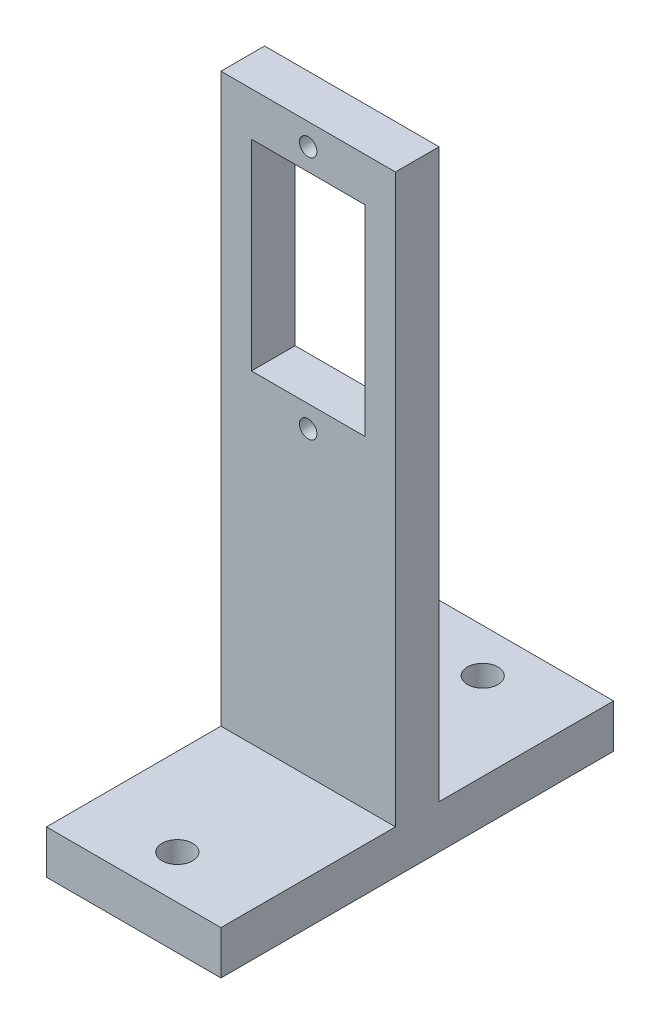
ISO-10303-21;
HEADER;
FILE_DESCRIPTION(('STEP AP214'),'2;1');
FILE_NAME('part.step','',(''),(''),'','','');
FILE_SCHEMA(('AUTOMOTIVE_DESIGN { 1 0 10303 214 1 1 1 1 }'));
ENDSEC;
DATA;
#1=APPLICATION_CONTEXT('core data for automotive mechanical design processes');
#2=APPLICATION_PROTOCOL_DEFINITION('international standard','automotive_design',2000,#1);
#3=PRODUCT_CONTEXT('',#1,'mechanical');
#4=PRODUCT('Part','Part','',(#3));
#5=PRODUCT_RELATED_PRODUCT_CATEGORY('part','',(#4));
#6=PRODUCT_DEFINITION_FORMATION('','',#4);
#7=PRODUCT_DEFINITION_CONTEXT('part definition',#1,'design');
#8=PRODUCT_DEFINITION('design','',#6,#7);
#9=PRODUCT_DEFINITION_SHAPE('','',#8);
#10=(LENGTH_UNIT() NAMED_UNIT(*) SI_UNIT(.MILLI.,.METRE.));
#11=(NAMED_UNIT(*) PLANE_ANGLE_UNIT() SI_UNIT($,.RADIAN.));
#12=(NAMED_UNIT(*) SI_UNIT($,.STERADIAN.) SOLID_ANGLE_UNIT());
#13=UNCERTAINTY_MEASURE_WITH_UNIT(LENGTH_MEASURE(1.E-05),#10,'distance_accuracy_value','');
#14=(GEOMETRIC_REPRESENTATION_CONTEXT(3) GLOBAL_UNCERTAINTY_ASSIGNED_CONTEXT((#13)) GLOBAL_UNIT_ASSIGNED_CONTEXT((#10,
#11,#12)) REPRESENTATION_CONTEXT('',''));
#15=CARTESIAN_POINT('',(0.,0.,0.));
#16=DIRECTION('',(0.,0.,1.));
#17=DIRECTION('',(1.,0.,0.));
#18=AXIS2_PLACEMENT_3D('',#15,#16,#17);
#19=CARTESIAN_POINT('',(0.,70.,0.));
#20=DIRECTION('',(0.,0.,-1.));
#21=DIRECTION('',(-1.,0.,0.));
#22=AXIS2_PLACEMENT_3D('',#19,#20,#21);
#23=PLANE('',#22);
#24=DIRECTION('',(1.,0.,0.));
#25=VECTOR('',#24,1.);
#26=CARTESIAN_POINT('',(3.5,42.,0.));
#27=LINE('',#26,#25);
#28=CARTESIAN_POINT('',(3.5,42.,0.));
#29=VERTEX_POINT('',#28);
#30=CARTESIAN_POINT('',(16.5,42.,0.));
#31=VERTEX_POINT('',#30);
#32=EDGE_CURVE('E181',#29,#31,#27,.T.);
#33=ORIENTED_EDGE('',*,*,#32,.F.);
#34=DIRECTION('',(0.,-1.,0.));
#35=VECTOR('',#34,1.);
#36=CARTESIAN_POINT('',(3.5,65.,0.));
#37=LINE('',#36,#35);
#38=CARTESIAN_POINT('',(3.5,65.,0.));
#39=VERTEX_POINT('',#38);
#40=EDGE_CURVE('E179',#39,#29,#37,.T.);
#41=ORIENTED_EDGE('',*,*,#40,.F.);
#42=DIRECTION('',(-1.,0.,0.));
#43=VECTOR('',#42,1.);
#44=CARTESIAN_POINT('',(3.5,65.,0.));
#45=LINE('',#44,#43);
#46=CARTESIAN_POINT('',(16.5,65.,0.));
#47=VERTEX_POINT('',#46);
#48=EDGE_CURVE('E188',#47,#39,#45,.T.);
#49=ORIENTED_EDGE('',*,*,#48,.F.);
#50=DIRECTION('',(0.,1.,0.));
#51=VECTOR('',#50,1.);
#52=CARTESIAN_POINT('',(16.5,65.,0.));
#53=LINE('',#52,#51);
#54=EDGE_CURVE('E185',#31,#47,#53,.T.);
#55=ORIENTED_EDGE('',*,*,#54,.F.);
#56=EDGE_LOOP('',(#33,#41,#49,#55));
#57=FACE_BOUND('',#56,.T.);
#58=CARTESIAN_POINT('',(10.,39.5,0.));
#59=DIRECTION('',(0.,0.,1.));
#60=DIRECTION('',(1.,0.,0.));
#61=AXIS2_PLACEMENT_3D('',#58,#59,#60);
#62=CIRCLE('',#61,1.);
#63=CARTESIAN_POINT('',(11.,39.5,0.));
#64=VERTEX_POINT('',#63);
#65=EDGE_CURVE('E172',#64,#64,#62,.T.);
#66=ORIENTED_EDGE('',*,*,#65,.F.);
#67=EDGE_LOOP('',(#66));
#68=FACE_BOUND('',#67,.T.);
#69=CARTESIAN_POINT('',(10.,67.5,0.));
#70=DIRECTION('',(0.,0.,1.));
#71=DIRECTION('',(1.,0.,0.));
#72=AXIS2_PLACEMENT_3D('',#69,#70,#71);
#73=CIRCLE('',#72,1.);
#74=CARTESIAN_POINT('',(11.,67.5,0.));
#75=VERTEX_POINT('',#74);
#76=EDGE_CURVE('E173',#75,#75,#73,.T.);
#77=ORIENTED_EDGE('',*,*,#76,.F.);
#78=EDGE_LOOP('',(#77));
#79=FACE_BOUND('',#78,.T.);
#80=DIRECTION('',(-1.,0.,0.));
#81=VECTOR('',#80,1.);
#82=CARTESIAN_POINT('',(0.,5.,0.));
#83=LINE('',#82,#81);
#84=CARTESIAN_POINT('',(20.,5.,0.));
#85=VERTEX_POINT('',#84);
#86=CARTESIAN_POINT('',(0.,5.,0.));
#87=VERTEX_POINT('',#86);
#88=EDGE_CURVE('E48',#85,#87,#83,.T.);
#89=ORIENTED_EDGE('',*,*,#88,.F.);
#90=DIRECTION('',(0.,-1.,0.));
#91=VECTOR('',#90,1.);
#92=CARTESIAN_POINT('',(20.,70.,0.));
#93=LINE('',#92,#91);
#94=CARTESIAN_POINT('',(20.,70.,0.));
#95=VERTEX_POINT('',#94);
#96=EDGE_CURVE('E213',#95,#85,#93,.T.);
#97=ORIENTED_EDGE('',*,*,#96,.F.);
#98=DIRECTION('',(1.,0.,0.));
#99=VECTOR('',#98,1.);
#100=CARTESIAN_POINT('',(0.,70.,0.));
#101=LINE('',#100,#99);
#102=CARTESIAN_POINT('',(0.,70.,0.));
#103=VERTEX_POINT('',#102);
#104=EDGE_CURVE('E202',#103,#95,#101,.T.);
#105=ORIENTED_EDGE('',*,*,#104,.F.);
#106=DIRECTION('',(0.,-1.,0.));
#107=VECTOR('',#106,1.);
#108=CARTESIAN_POINT('',(0.,70.,0.));
#109=LINE('',#108,#107);
#110=EDGE_CURVE('E215',#103,#87,#109,.T.);
#111=ORIENTED_EDGE('',*,*,#110,.T.);
#112=EDGE_LOOP('',(#89,#97,#105,#111));
#113=FACE_BOUND('',#112,.T.);
#114=ADVANCED_FACE('F33',(#57,#68,#79,#113),#23,.F.);
#115=CARTESIAN_POINT('',(0.,70.,-5.));
#116=DIRECTION('',(0.,0.,1.));
#117=DIRECTION('',(1.,0.,0.));
#118=AXIS2_PLACEMENT_3D('',#115,#116,#117);
#119=PLANE('',#118);
#120=DIRECTION('',(-1.,0.,0.));
#121=VECTOR('',#120,1.);
#122=CARTESIAN_POINT('',(0.,65.,-5.));
#123=LINE('',#122,#121);
#124=CARTESIAN_POINT('',(16.5,65.,-5.));
#125=VERTEX_POINT('',#124);
#126=CARTESIAN_POINT('',(3.5,65.,-5.));
#127=VERTEX_POINT('',#126);
#128=EDGE_CURVE('E223',#125,#127,#123,.T.);
#129=ORIENTED_EDGE('',*,*,#128,.T.);
#130=DIRECTION('',(0.,-1.,0.));
#131=VECTOR('',#130,1.);
#132=CARTESIAN_POINT('',(3.5,70.,-5.));
#133=LINE('',#132,#131);
#134=CARTESIAN_POINT('',(3.5,42.,-5.));
#135=VERTEX_POINT('',#134);
#136=EDGE_CURVE('E41',#127,#135,#133,.T.);
#137=ORIENTED_EDGE('',*,*,#136,.T.);
#138=DIRECTION('',(1.,0.,0.));
#139=VECTOR('',#138,1.);
#140=CARTESIAN_POINT('',(0.,42.,-5.));
#141=LINE('',#140,#139);
#142=CARTESIAN_POINT('',(16.5,42.,-5.));
#143=VERTEX_POINT('',#142);
#144=EDGE_CURVE('E217',#135,#143,#141,.T.);
#145=ORIENTED_EDGE('',*,*,#144,.T.);
#146=DIRECTION('',(0.,1.,0.));
#147=VECTOR('',#146,1.);
#148=CARTESIAN_POINT('',(16.5,70.,-5.));
#149=LINE('',#148,#147);
#150=EDGE_CURVE('E220',#143,#125,#149,.T.);
#151=ORIENTED_EDGE('',*,*,#150,.T.);
#152=EDGE_LOOP('',(#129,#137,#145,#151));
#153=FACE_BOUND('',#152,.T.);
#154=CARTESIAN_POINT('',(10.,39.5,-5.));
#155=DIRECTION('',(0.,0.,1.));
#156=DIRECTION('',(1.,0.,0.));
#157=AXIS2_PLACEMENT_3D('',#154,#155,#156);
#158=CIRCLE('',#157,1.);
#159=CARTESIAN_POINT('',(11.,39.5,-5.));
#160=VERTEX_POINT('',#159);
#161=EDGE_CURVE('E176',#160,#160,#158,.T.);
#162=ORIENTED_EDGE('',*,*,#161,.T.);
#163=EDGE_LOOP('',(#162));
#164=FACE_BOUND('',#163,.T.);
#165=CARTESIAN_POINT('',(10.,67.5,-5.));
#166=DIRECTION('',(0.,0.,1.));
#167=DIRECTION('',(1.,0.,0.));
#168=AXIS2_PLACEMENT_3D('',#165,#166,#167);
#169=CIRCLE('',#168,1.);
#170=CARTESIAN_POINT('',(11.,67.5,-5.));
#171=VERTEX_POINT('',#170);
#172=EDGE_CURVE('E182',#171,#171,#169,.T.);
#173=ORIENTED_EDGE('',*,*,#172,.T.);
#174=EDGE_LOOP('',(#173));
#175=FACE_BOUND('',#174,.T.);
#176=DIRECTION('',(1.,0.,0.));
#177=VECTOR('',#176,1.);
#178=CARTESIAN_POINT('',(0.,5.,-5.));
#179=LINE('',#178,#177);
#180=CARTESIAN_POINT('',(0.,5.,-5.));
#181=VERTEX_POINT('',#180);
#182=CARTESIAN_POINT('',(20.,5.,-5.));
#183=VERTEX_POINT('',#182);
#184=EDGE_CURVE('E11',#181,#183,#179,.T.);
#185=ORIENTED_EDGE('',*,*,#184,.F.);
#186=DIRECTION('',(0.,-1.,0.));
#187=VECTOR('',#186,1.);
#188=CARTESIAN_POINT('',(0.,70.,-5.));
#189=LINE('',#188,#187);
#190=CARTESIAN_POINT('',(0.,70.,-5.));
#191=VERTEX_POINT('',#190);
#192=EDGE_CURVE('E207',#191,#181,#189,.T.);
#193=ORIENTED_EDGE('',*,*,#192,.F.);
#194=DIRECTION('',(-1.,0.,0.));
#195=VECTOR('',#194,1.);
#196=CARTESIAN_POINT('',(0.,70.,-5.));
#197=LINE('',#196,#195);
#198=CARTESIAN_POINT('',(20.,70.,-5.));
#199=VERTEX_POINT('',#198);
#200=EDGE_CURVE('E206',#199,#191,#197,.T.);
#201=ORIENTED_EDGE('',*,*,#200,.F.);
#202=DIRECTION('',(0.,-1.,0.));
#203=VECTOR('',#202,1.);
#204=CARTESIAN_POINT('',(20.,70.,-5.));
#205=LINE('',#204,#203);
#206=EDGE_CURVE('E211',#199,#183,#205,.T.);
#207=ORIENTED_EDGE('',*,*,#206,.T.);
#208=EDGE_LOOP('',(#185,#193,#201,#207));
#209=FACE_BOUND('',#208,.T.);
#210=ADVANCED_FACE('F232',(#153,#164,#175,#209),#119,.F.);
#211=CARTESIAN_POINT('',(0.,70.,0.));
#212=DIRECTION('',(1.,0.,0.));
#213=DIRECTION('',(0.,0.,-1.));
#214=AXIS2_PLACEMENT_3D('',#211,#212,#213);
#215=PLANE('',#214);
#216=DIRECTION('',(0.,0.,1.));
#217=VECTOR('',#216,1.);
#218=CARTESIAN_POINT('',(0.,0.,0.));
#219=LINE('',#218,#217);
#220=CARTESIAN_POINT('',(0.,0.,-25.));
#221=VERTEX_POINT('',#220);
#222=CARTESIAN_POINT('',(0.,0.,20.));
#223=VERTEX_POINT('',#222);
#224=EDGE_CURVE('E122',#221,#223,#219,.T.);
#225=ORIENTED_EDGE('',*,*,#224,.T.);
#226=DIRECTION('',(0.,-1.,0.));
#227=VECTOR('',#226,1.);
#228=CARTESIAN_POINT('',(0.,0.,20.));
#229=LINE('',#228,#227);
#230=CARTESIAN_POINT('',(0.,5.,20.));
#231=VERTEX_POINT('',#230);
#232=EDGE_CURVE('E157',#231,#223,#229,.T.);
#233=ORIENTED_EDGE('',*,*,#232,.F.);
#234=DIRECTION('',(0.,0.,-1.));
#235=VECTOR('',#234,1.);
#236=CARTESIAN_POINT('',(0.,5.,20.));
#237=LINE('',#236,#235);
#238=EDGE_CURVE('E164',#231,#87,#237,.T.);
#239=ORIENTED_EDGE('',*,*,#238,.T.);
#240=ORIENTED_EDGE('',*,*,#110,.F.);
#241=DIRECTION('',(0.,0.,1.));
#242=VECTOR('',#241,1.);
#243=CARTESIAN_POINT('',(0.,70.,0.));
#244=LINE('',#243,#242);
#245=EDGE_CURVE('E199',#191,#103,#244,.T.);
#246=ORIENTED_EDGE('',*,*,#245,.F.);
#247=ORIENTED_EDGE('',*,*,#192,.T.);
#248=CARTESIAN_POINT('',(0.,5.,-25.));
#249=VERTEX_POINT('',#248);
#250=EDGE_CURVE('E146',#181,#249,#237,.T.);
#251=ORIENTED_EDGE('',*,*,#250,.T.);
#252=DIRECTION('',(0.,-1.,0.));
#253=VECTOR('',#252,1.);
#254=CARTESIAN_POINT('',(0.,0.,-25.));
#255=LINE('',#254,#253);
#256=EDGE_CURVE('E140',#249,#221,#255,.T.);
#257=ORIENTED_EDGE('',*,*,#256,.T.);
#258=EDGE_LOOP('',(#225,#233,#239,#240,#246,#247,#251,#257));
#259=FACE_BOUND('',#258,.T.);
#260=ADVANCED_FACE('F35',(#259),#215,.F.);
#261=CARTESIAN_POINT('',(20.,70.,0.));
#262=DIRECTION('',(-1.,0.,0.));
#263=DIRECTION('',(0.,0.,1.));
#264=AXIS2_PLACEMENT_3D('',#261,#262,#263);
#265=PLANE('',#264);
#266=DIRECTION('',(0.,0.,-1.));
#267=VECTOR('',#266,1.);
#268=CARTESIAN_POINT('',(20.,0.,0.));
#269=LINE('',#268,#267);
#270=CARTESIAN_POINT('',(20.,0.,20.));
#271=VERTEX_POINT('',#270);
#272=CARTESIAN_POINT('',(20.,0.,-25.));
#273=VERTEX_POINT('',#272);
#274=EDGE_CURVE('E132',#271,#273,#269,.T.);
#275=ORIENTED_EDGE('',*,*,#274,.T.);
#276=DIRECTION('',(0.,1.,0.));
#277=VECTOR('',#276,1.);
#278=CARTESIAN_POINT('',(20.,0.,-25.));
#279=LINE('',#278,#277);
#280=CARTESIAN_POINT('',(20.,5.,-25.));
#281=VERTEX_POINT('',#280);
#282=EDGE_CURVE('E143',#273,#281,#279,.T.);
#283=ORIENTED_EDGE('',*,*,#282,.T.);
#284=DIRECTION('',(0.,0.,-1.));
#285=VECTOR('',#284,1.);
#286=CARTESIAN_POINT('',(20.,5.,20.));
#287=LINE('',#286,#285);
#288=EDGE_CURVE('E167',#183,#281,#287,.T.);
#289=ORIENTED_EDGE('',*,*,#288,.F.);
#290=ORIENTED_EDGE('',*,*,#206,.F.);
#291=DIRECTION('',(0.,0.,-1.));
#292=VECTOR('',#291,1.);
#293=CARTESIAN_POINT('',(20.,70.,0.));
#294=LINE('',#293,#292);
#295=EDGE_CURVE('E204',#95,#199,#294,.T.);
#296=ORIENTED_EDGE('',*,*,#295,.F.);
#297=ORIENTED_EDGE('',*,*,#96,.T.);
#298=CARTESIAN_POINT('',(20.,5.,20.));
#299=VERTEX_POINT('',#298);
#300=EDGE_CURVE('E168',#299,#85,#287,.T.);
#301=ORIENTED_EDGE('',*,*,#300,.F.);
#302=DIRECTION('',(0.,1.,0.));
#303=VECTOR('',#302,1.);
#304=CARTESIAN_POINT('',(20.,0.,20.));
#305=LINE('',#304,#303);
#306=EDGE_CURVE('E160',#271,#299,#305,.T.);
#307=ORIENTED_EDGE('',*,*,#306,.F.);
#308=EDGE_LOOP('',(#275,#283,#289,#290,#296,#297,#301,#307));
#309=FACE_BOUND('',#308,.T.);
#310=ADVANCED_FACE('F259',(#309),#265,.F.);
#311=CARTESIAN_POINT('',(0.,70.,0.));
#312=DIRECTION('',(0.,-1.,0.));
#313=DIRECTION('',(0.,0.,-1.));
#314=AXIS2_PLACEMENT_3D('',#311,#312,#313);
#315=PLANE('',#314);
#316=ORIENTED_EDGE('',*,*,#245,.T.);
#317=ORIENTED_EDGE('',*,*,#104,.T.);
#318=ORIENTED_EDGE('',*,*,#295,.T.);
#319=ORIENTED_EDGE('',*,*,#200,.T.);
#320=EDGE_LOOP('',(#316,#317,#318,#319));
#321=FACE_BOUND('',#320,.T.);
#322=ADVANCED_FACE('F261',(#321),#315,.F.);
#323=CARTESIAN_POINT('',(0.,0.,0.));
#324=DIRECTION('',(0.,-1.,0.));
#325=DIRECTION('',(0.,0.,-1.));
#326=AXIS2_PLACEMENT_3D('',#323,#324,#325);
#327=PLANE('',#326);
#328=CARTESIAN_POINT('',(10.,0.,-20.));
#329=DIRECTION('',(0.,-1.,0.));
#330=DIRECTION('',(0.,0.,-1.));
#331=AXIS2_PLACEMENT_3D('',#328,#329,#330);
#332=CIRCLE('',#331,1.75);
#333=CARTESIAN_POINT('',(10.,0.,-21.75));
#334=VERTEX_POINT('',#333);
#335=EDGE_CURVE('E406',#334,#334,#332,.T.);
#336=ORIENTED_EDGE('',*,*,#335,.F.);
#337=EDGE_LOOP('',(#336));
#338=FACE_BOUND('',#337,.T.);
#339=CARTESIAN_POINT('',(10.,0.,15.));
#340=DIRECTION('',(0.,-1.,0.));
#341=DIRECTION('',(0.,0.,-1.));
#342=AXIS2_PLACEMENT_3D('',#339,#340,#341);
#343=CIRCLE('',#342,1.75);
#344=CARTESIAN_POINT('',(10.,0.,13.25));
#345=VERTEX_POINT('',#344);
#346=EDGE_CURVE('E147',#345,#345,#343,.T.);
#347=ORIENTED_EDGE('',*,*,#346,.F.);
#348=EDGE_LOOP('',(#347));
#349=FACE_BOUND('',#348,.T.);
#350=ORIENTED_EDGE('',*,*,#224,.F.);
#351=DIRECTION('',(1.,0.,0.));
#352=VECTOR('',#351,1.);
#353=CARTESIAN_POINT('',(0.,0.,-25.));
#354=LINE('',#353,#352);
#355=EDGE_CURVE('E125',#221,#273,#354,.T.);
#356=ORIENTED_EDGE('',*,*,#355,.T.);
#357=ORIENTED_EDGE('',*,*,#274,.F.);
#358=DIRECTION('',(1.,0.,0.));
#359=VECTOR('',#358,1.);
#360=CARTESIAN_POINT('',(0.,0.,20.));
#361=LINE('',#360,#359);
#362=EDGE_CURVE('E127',#223,#271,#361,.T.);
#363=ORIENTED_EDGE('',*,*,#362,.F.);
#364=EDGE_LOOP('',(#350,#356,#357,#363));
#365=FACE_BOUND('',#364,.T.);
#366=ADVANCED_FACE('F124',(#338,#349,#365),#327,.T.);
#367=CARTESIAN_POINT('',(3.5,65.,-70.));
#368=DIRECTION('',(-1.,0.,0.));
#369=DIRECTION('',(0.,-1.,0.));
#370=AXIS2_PLACEMENT_3D('',#367,#368,#369);
#371=PLANE('',#370);
#372=DIRECTION('',(0.,0.,1.));
#373=VECTOR('',#372,1.);
#374=CARTESIAN_POINT('',(3.5,65.,-70.));
#375=LINE('',#374,#373);
#376=EDGE_CURVE('E133',#127,#39,#375,.T.);
#377=ORIENTED_EDGE('',*,*,#376,.T.);
#378=ORIENTED_EDGE('',*,*,#40,.T.);
#379=DIRECTION('',(0.,0.,1.));
#380=VECTOR('',#379,1.);
#381=CARTESIAN_POINT('',(3.5,42.,-70.));
#382=LINE('',#381,#380);
#383=EDGE_CURVE('E191',#135,#29,#382,.T.);
#384=ORIENTED_EDGE('',*,*,#383,.F.);
#385=ORIENTED_EDGE('',*,*,#136,.F.);
#386=EDGE_LOOP('',(#377,#378,#384,#385));
#387=FACE_BOUND('',#386,.T.);
#388=ADVANCED_FACE('F266',(#387),#371,.F.);
#389=CARTESIAN_POINT('',(3.5,65.,-70.));
#390=DIRECTION('',(0.,1.,0.));
#391=DIRECTION('',(0.,0.,1.));
#392=AXIS2_PLACEMENT_3D('',#389,#390,#391);
#393=PLANE('',#392);
#394=DIRECTION('',(0.,0.,1.));
#395=VECTOR('',#394,1.);
#396=CARTESIAN_POINT('',(16.5,65.,-70.));
#397=LINE('',#396,#395);
#398=EDGE_CURVE('E193',#125,#47,#397,.T.);
#399=ORIENTED_EDGE('',*,*,#398,.T.);
#400=ORIENTED_EDGE('',*,*,#48,.T.);
#401=ORIENTED_EDGE('',*,*,#376,.F.);
#402=ORIENTED_EDGE('',*,*,#128,.F.);
#403=EDGE_LOOP('',(#399,#400,#401,#402));
#404=FACE_BOUND('',#403,.T.);
#405=ADVANCED_FACE('F273',(#404),#393,.F.);
#406=CARTESIAN_POINT('',(16.5,65.,-70.));
#407=DIRECTION('',(1.,0.,0.));
#408=DIRECTION('',(0.,0.,-1.));
#409=AXIS2_PLACEMENT_3D('',#406,#407,#408);
#410=PLANE('',#409);
#411=DIRECTION('',(0.,0.,1.));
#412=VECTOR('',#411,1.);
#413=CARTESIAN_POINT('',(16.5,42.,-70.));
#414=LINE('',#413,#412);
#415=EDGE_CURVE('E195',#143,#31,#414,.T.);
#416=ORIENTED_EDGE('',*,*,#415,.T.);
#417=ORIENTED_EDGE('',*,*,#54,.T.);
#418=ORIENTED_EDGE('',*,*,#398,.F.);
#419=ORIENTED_EDGE('',*,*,#150,.F.);
#420=EDGE_LOOP('',(#416,#417,#418,#419));
#421=FACE_BOUND('',#420,.T.);
#422=ADVANCED_FACE('F277',(#421),#410,.F.);
#423=CARTESIAN_POINT('',(3.5,42.,-70.));
#424=DIRECTION('',(0.,-1.,0.));
#425=DIRECTION('',(0.,0.,-1.));
#426=AXIS2_PLACEMENT_3D('',#423,#424,#425);
#427=PLANE('',#426);
#428=ORIENTED_EDGE('',*,*,#383,.T.);
#429=ORIENTED_EDGE('',*,*,#32,.T.);
#430=ORIENTED_EDGE('',*,*,#415,.F.);
#431=ORIENTED_EDGE('',*,*,#144,.F.);
#432=EDGE_LOOP('',(#428,#429,#430,#431));
#433=FACE_BOUND('',#432,.T.);
#434=ADVANCED_FACE('F245',(#433),#427,.F.);
#435=CARTESIAN_POINT('',(10.,39.5,-70.));
#436=DIRECTION('',(0.,0.,1.));
#437=DIRECTION('',(1.,0.,0.));
#438=AXIS2_PLACEMENT_3D('',#435,#436,#437);
#439=CYLINDRICAL_SURFACE('',#438,1.);
#440=ORIENTED_EDGE('',*,*,#65,.T.);
#441=EDGE_LOOP('',(#440));
#442=FACE_BOUND('',#441,.T.);
#443=ORIENTED_EDGE('',*,*,#161,.F.);
#444=EDGE_LOOP('',(#443));
#445=FACE_BOUND('',#444,.T.);
#446=ADVANCED_FACE('F236',(#442,#445),#439,.F.);
#447=CARTESIAN_POINT('',(10.,67.5,-70.));
#448=DIRECTION('',(0.,0.,1.));
#449=DIRECTION('',(1.,0.,0.));
#450=AXIS2_PLACEMENT_3D('',#447,#448,#449);
#451=CYLINDRICAL_SURFACE('',#450,1.);
#452=ORIENTED_EDGE('',*,*,#76,.T.);
#453=EDGE_LOOP('',(#452));
#454=FACE_BOUND('',#453,.T.);
#455=ORIENTED_EDGE('',*,*,#172,.F.);
#456=EDGE_LOOP('',(#455));
#457=FACE_BOUND('',#456,.T.);
#458=ADVANCED_FACE('F234',(#454,#457),#451,.F.);
#459=CARTESIAN_POINT('',(0.,0.,-25.));
#460=DIRECTION('',(0.,0.,-1.));
#461=DIRECTION('',(-1.,0.,0.));
#462=AXIS2_PLACEMENT_3D('',#459,#460,#461);
#463=PLANE('',#462);
#464=ORIENTED_EDGE('',*,*,#256,.F.);
#465=DIRECTION('',(-1.,0.,0.));
#466=VECTOR('',#465,1.);
#467=CARTESIAN_POINT('',(0.,5.,-25.));
#468=LINE('',#467,#466);
#469=EDGE_CURVE('E155',#281,#249,#468,.T.);
#470=ORIENTED_EDGE('',*,*,#469,.F.);
#471=ORIENTED_EDGE('',*,*,#282,.F.);
#472=ORIENTED_EDGE('',*,*,#355,.F.);
#473=EDGE_LOOP('',(#464,#470,#471,#472));
#474=FACE_BOUND('',#473,.T.);
#475=ADVANCED_FACE('F138',(#474),#463,.T.);
#476=CARTESIAN_POINT('',(0.,5.,20.));
#477=DIRECTION('',(0.,-1.,0.));
#478=DIRECTION('',(0.,0.,-1.));
#479=AXIS2_PLACEMENT_3D('',#476,#477,#478);
#480=PLANE('',#479);
#481=CARTESIAN_POINT('',(10.,5.,-20.));
#482=DIRECTION('',(0.,1.,0.));
#483=DIRECTION('',(0.,0.,1.));
#484=AXIS2_PLACEMENT_3D('',#481,#482,#483);
#485=CIRCLE('',#484,1.75);
#486=CARTESIAN_POINT('',(10.,5.,-18.25));
#487=VERTEX_POINT('',#486);
#488=EDGE_CURVE('E409',#487,#487,#485,.T.);
#489=ORIENTED_EDGE('',*,*,#488,.F.);
#490=EDGE_LOOP('',(#489));
#491=FACE_BOUND('',#490,.T.);
#492=ORIENTED_EDGE('',*,*,#250,.F.);
#493=ORIENTED_EDGE('',*,*,#184,.T.);
#494=ORIENTED_EDGE('',*,*,#288,.T.);
#495=ORIENTED_EDGE('',*,*,#469,.T.);
#496=EDGE_LOOP('',(#492,#493,#494,#495));
#497=FACE_BOUND('',#496,.T.);
#498=ADVANCED_FACE('F243',(#491,#497),#480,.F.);
#499=CARTESIAN_POINT('',(10.,5.,15.));
#500=DIRECTION('',(0.,1.,0.));
#501=DIRECTION('',(0.,0.,1.));
#502=AXIS2_PLACEMENT_3D('',#499,#500,#501);
#503=CIRCLE('',#502,1.75);
#504=CARTESIAN_POINT('',(10.,5.,16.75));
#505=VERTEX_POINT('',#504);
#506=EDGE_CURVE('E150',#505,#505,#503,.T.);
#507=ORIENTED_EDGE('',*,*,#506,.F.);
#508=EDGE_LOOP('',(#507));
#509=FACE_BOUND('',#508,.T.);
#510=ORIENTED_EDGE('',*,*,#300,.T.);
#511=ORIENTED_EDGE('',*,*,#88,.T.);
#512=ORIENTED_EDGE('',*,*,#238,.F.);
#513=DIRECTION('',(-1.,0.,0.));
#514=VECTOR('',#513,1.);
#515=CARTESIAN_POINT('',(0.,5.,20.));
#516=LINE('',#515,#514);
#517=EDGE_CURVE('E162',#299,#231,#516,.T.);
#518=ORIENTED_EDGE('',*,*,#517,.F.);
#519=EDGE_LOOP('',(#510,#511,#512,#518));
#520=FACE_BOUND('',#519,.T.);
#521=ADVANCED_FACE('F359',(#509,#520),#480,.F.);
#522=CARTESIAN_POINT('',(0.,0.,20.));
#523=DIRECTION('',(0.,0.,-1.));
#524=DIRECTION('',(-1.,0.,0.));
#525=AXIS2_PLACEMENT_3D('',#522,#523,#524);
#526=PLANE('',#525);
#527=ORIENTED_EDGE('',*,*,#232,.T.);
#528=ORIENTED_EDGE('',*,*,#362,.T.);
#529=ORIENTED_EDGE('',*,*,#306,.T.);
#530=ORIENTED_EDGE('',*,*,#517,.T.);
#531=EDGE_LOOP('',(#527,#528,#529,#530));
#532=FACE_BOUND('',#531,.T.);
#533=ADVANCED_FACE('F353',(#532),#526,.F.);
#534=CARTESIAN_POINT('',(10.,-20.,15.));
#535=DIRECTION('',(0.,1.,0.));
#536=DIRECTION('',(0.,0.,1.));
#537=AXIS2_PLACEMENT_3D('',#534,#535,#536);
#538=CYLINDRICAL_SURFACE('',#537,1.75);
#539=ORIENTED_EDGE('',*,*,#346,.T.);
#540=EDGE_LOOP('',(#539));
#541=FACE_BOUND('',#540,.T.);
#542=ORIENTED_EDGE('',*,*,#506,.T.);
#543=EDGE_LOOP('',(#542));
#544=FACE_BOUND('',#543,.T.);
#545=ADVANCED_FACE('F358',(#541,#544),#538,.F.);
#546=CARTESIAN_POINT('',(10.,-20.,-20.));
#547=DIRECTION('',(0.,1.,0.));
#548=DIRECTION('',(0.,0.,1.));
#549=AXIS2_PLACEMENT_3D('',#546,#547,#548);
#550=CYLINDRICAL_SURFACE('',#549,1.75);
#551=ORIENTED_EDGE('',*,*,#335,.T.);
#552=EDGE_LOOP('',(#551));
#553=FACE_BOUND('',#552,.T.);
#554=ORIENTED_EDGE('',*,*,#488,.T.);
#555=EDGE_LOOP('',(#554));
#556=FACE_BOUND('',#555,.T.);
#557=ADVANCED_FACE('F389',(#553,#556),#550,.F.);
#558=CLOSED_SHELL('',(#114,#210,#260,#310,#322,#366,#388,#405,#422,#434,#446,#458,#475,#498,
#521,#533,#545,#557));
#559=MANIFOLD_SOLID_BREP('B2',#558);
#560=ADVANCED_BREP_SHAPE_REPRESENTATION('',(#18,#559),#14);
#561=SHAPE_DEFINITION_REPRESENTATION(#9,#560);
ENDSEC;
END-ISO-10303-21;
